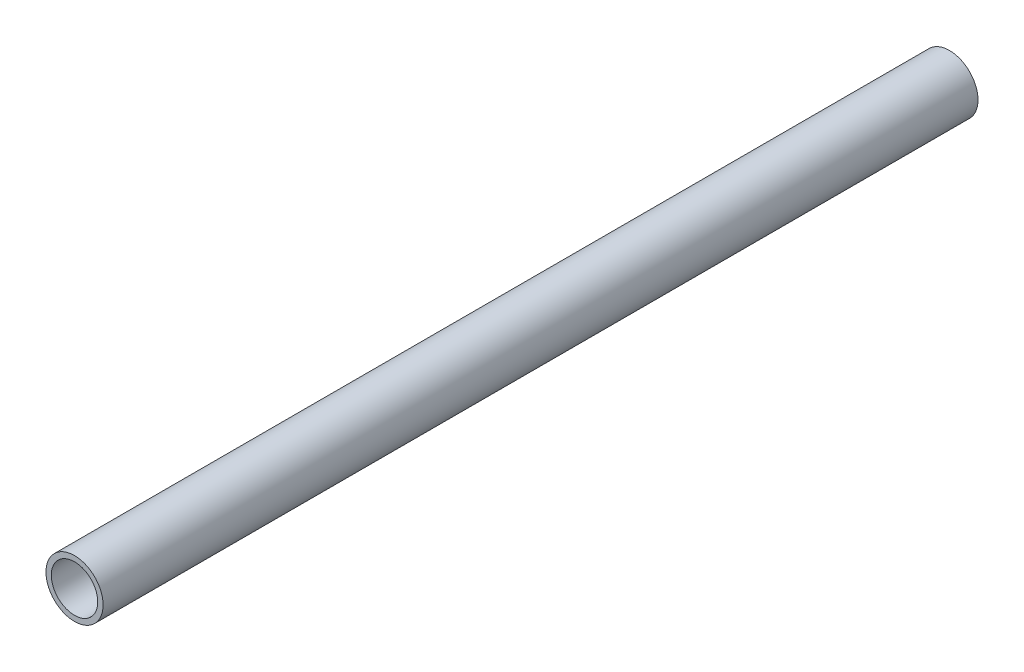
ISO-10303-21;
HEADER;
FILE_DESCRIPTION(('STEP AP214'),'2;1');
FILE_NAME('part.step','',(''),(''),'','','');
FILE_SCHEMA(('AUTOMOTIVE_DESIGN { 1 0 10303 214 1 1 1 1 }'));
ENDSEC;
DATA;
#1=APPLICATION_CONTEXT('core data for automotive mechanical design processes');
#2=APPLICATION_PROTOCOL_DEFINITION('international standard','automotive_design',2000,#1);
#3=PRODUCT_CONTEXT('',#1,'mechanical');
#4=PRODUCT('Part','Part','',(#3));
#5=PRODUCT_RELATED_PRODUCT_CATEGORY('part','',(#4));
#6=PRODUCT_DEFINITION_FORMATION('','',#4);
#7=PRODUCT_DEFINITION_CONTEXT('part definition',#1,'design');
#8=PRODUCT_DEFINITION('design','',#6,#7);
#9=PRODUCT_DEFINITION_SHAPE('','',#8);
#10=(LENGTH_UNIT() NAMED_UNIT(*) SI_UNIT(.MILLI.,.METRE.));
#11=(NAMED_UNIT(*) PLANE_ANGLE_UNIT() SI_UNIT($,.RADIAN.));
#12=(NAMED_UNIT(*) SI_UNIT($,.STERADIAN.) SOLID_ANGLE_UNIT());
#13=UNCERTAINTY_MEASURE_WITH_UNIT(LENGTH_MEASURE(1.E-05),#10,'distance_accuracy_value','');
#14=(GEOMETRIC_REPRESENTATION_CONTEXT(3) GLOBAL_UNCERTAINTY_ASSIGNED_CONTEXT((#13)) GLOBAL_UNIT_ASSIGNED_CONTEXT((#10,
#11,#12)) REPRESENTATION_CONTEXT('',''));
#15=CARTESIAN_POINT('',(0.,0.,0.));
#16=DIRECTION('',(0.,0.,1.));
#17=DIRECTION('',(1.,0.,0.));
#18=AXIS2_PLACEMENT_3D('',#15,#16,#17);
#19=CARTESIAN_POINT('',(0.,0.,245.));
#20=DIRECTION('',(0.,0.,-1.));
#21=DIRECTION('',(-1.,0.,0.));
#22=AXIS2_PLACEMENT_3D('',#19,#20,#21);
#23=CYLINDRICAL_SURFACE('',#22,16.);
#24=CARTESIAN_POINT('',(0.,0.,245.));
#25=DIRECTION('',(0.,0.,1.));
#26=DIRECTION('',(1.,0.,0.));
#27=AXIS2_PLACEMENT_3D('',#24,#25,#26);
#28=CIRCLE('',#27,16.);
#29=CARTESIAN_POINT('',(16.,0.,245.));
#30=VERTEX_POINT('',#29);
#31=EDGE_CURVE('E10',#30,#30,#28,.T.);
#32=ORIENTED_EDGE('',*,*,#31,.F.);
#33=EDGE_LOOP('',(#32));
#34=FACE_BOUND('',#33,.T.);
#35=CARTESIAN_POINT('',(0.,0.,-245.));
#36=DIRECTION('',(0.,0.,1.));
#37=DIRECTION('',(1.,0.,0.));
#38=AXIS2_PLACEMENT_3D('',#35,#36,#37);
#39=CIRCLE('',#38,16.);
#40=CARTESIAN_POINT('',(16.,0.,-245.));
#41=VERTEX_POINT('',#40);
#42=EDGE_CURVE('E36',#41,#41,#39,.T.);
#43=ORIENTED_EDGE('',*,*,#42,.T.);
#44=EDGE_LOOP('',(#43));
#45=FACE_BOUND('',#44,.T.);
#46=ADVANCED_FACE('F33',(#34,#45),#23,.T.);
#47=CARTESIAN_POINT('',(0.,0.,245.));
#48=DIRECTION('',(0.,0.,1.));
#49=DIRECTION('',(1.,0.,0.));
#50=AXIS2_PLACEMENT_3D('',#47,#48,#49);
#51=PLANE('',#50);
#52=CARTESIAN_POINT('',(0.,0.,245.));
#53=DIRECTION('',(0.,0.,1.));
#54=DIRECTION('',(1.,0.,0.));
#55=AXIS2_PLACEMENT_3D('',#52,#53,#54);
#56=CIRCLE('',#55,13.);
#57=CARTESIAN_POINT('',(13.,0.,245.));
#58=VERTEX_POINT('',#57);
#59=EDGE_CURVE('E43',#58,#58,#56,.T.);
#60=ORIENTED_EDGE('',*,*,#59,.F.);
#61=EDGE_LOOP('',(#60));
#62=FACE_BOUND('',#61,.T.);
#63=ORIENTED_EDGE('',*,*,#31,.T.);
#64=EDGE_LOOP('',(#63));
#65=FACE_BOUND('',#64,.T.);
#66=ADVANCED_FACE('F54',(#62,#65),#51,.T.);
#67=CARTESIAN_POINT('',(0.,0.,-245.));
#68=DIRECTION('',(0.,0.,1.));
#69=DIRECTION('',(1.,0.,0.));
#70=AXIS2_PLACEMENT_3D('',#67,#68,#69);
#71=PLANE('',#70);
#72=CARTESIAN_POINT('',(0.,0.,-245.));
#73=DIRECTION('',(0.,0.,1.));
#74=DIRECTION('',(1.,0.,0.));
#75=AXIS2_PLACEMENT_3D('',#72,#73,#74);
#76=CIRCLE('',#75,13.);
#77=CARTESIAN_POINT('',(13.,0.,-245.));
#78=VERTEX_POINT('',#77);
#79=EDGE_CURVE('E45',#78,#78,#76,.T.);
#80=ORIENTED_EDGE('',*,*,#79,.T.);
#81=EDGE_LOOP('',(#80));
#82=FACE_BOUND('',#81,.T.);
#83=ORIENTED_EDGE('',*,*,#42,.F.);
#84=EDGE_LOOP('',(#83));
#85=FACE_BOUND('',#84,.T.);
#86=ADVANCED_FACE('F56',(#82,#85),#71,.F.);
#87=CARTESIAN_POINT('',(0.,0.,245.));
#88=DIRECTION('',(0.,0.,-1.));
#89=DIRECTION('',(-1.,0.,0.));
#90=AXIS2_PLACEMENT_3D('',#87,#88,#89);
#91=CYLINDRICAL_SURFACE('',#90,13.);
#92=ORIENTED_EDGE('',*,*,#59,.T.);
#93=EDGE_LOOP('',(#92));
#94=FACE_BOUND('',#93,.T.);
#95=ORIENTED_EDGE('',*,*,#79,.F.);
#96=EDGE_LOOP('',(#95));
#97=FACE_BOUND('',#96,.T.);
#98=ADVANCED_FACE('F51',(#94,#97),#91,.F.);
#99=CLOSED_SHELL('',(#46,#66,#86,#98));
#100=MANIFOLD_SOLID_BREP('B2',#99);
#101=ADVANCED_BREP_SHAPE_REPRESENTATION('',(#18,#100),#14);
#102=SHAPE_DEFINITION_REPRESENTATION(#9,#101);
ENDSEC;
END-ISO-10303-21;
